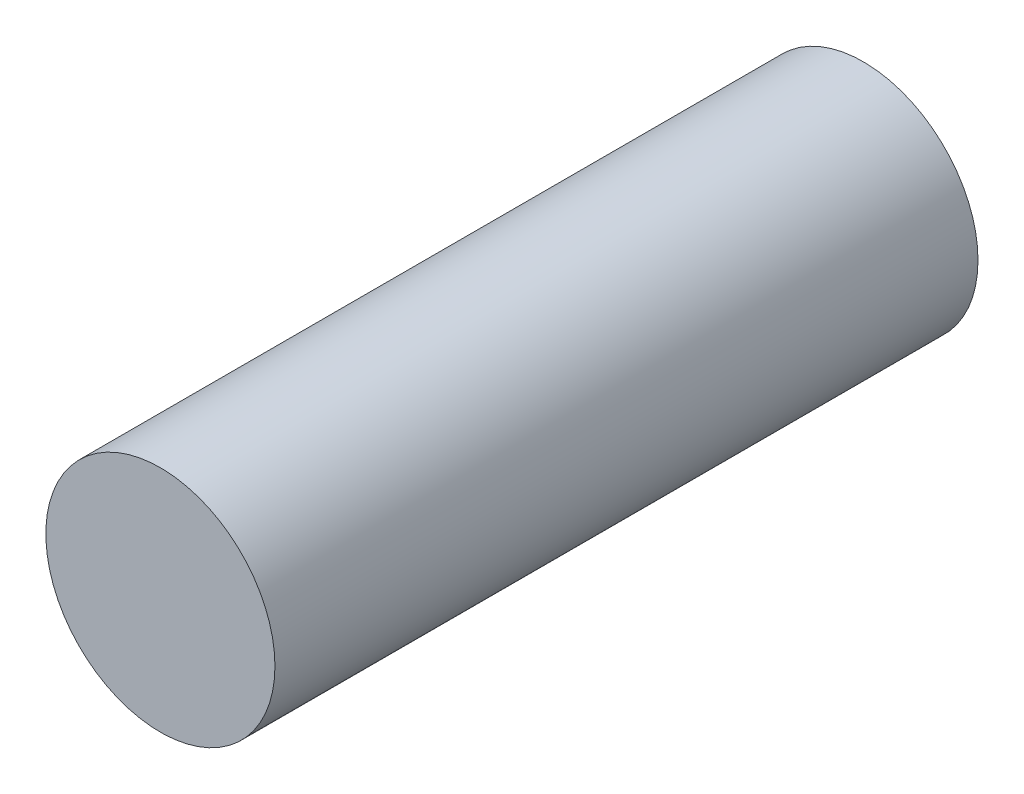
ISO-10303-21;
HEADER;
FILE_DESCRIPTION(('STEP AP214'),'2;1');
FILE_NAME('part.step','',(''),(''),'','','');
FILE_SCHEMA(('AUTOMOTIVE_DESIGN { 1 0 10303 214 1 1 1 1 }'));
ENDSEC;
DATA;
#1=APPLICATION_CONTEXT('core data for automotive mechanical design processes');
#2=APPLICATION_PROTOCOL_DEFINITION('international standard','automotive_design',2000,#1);
#3=PRODUCT_CONTEXT('',#1,'mechanical');
#4=PRODUCT('Part','Part','',(#3));
#5=PRODUCT_RELATED_PRODUCT_CATEGORY('part','',(#4));
#6=PRODUCT_DEFINITION_FORMATION('','',#4);
#7=PRODUCT_DEFINITION_CONTEXT('part definition',#1,'design');
#8=PRODUCT_DEFINITION('design','',#6,#7);
#9=PRODUCT_DEFINITION_SHAPE('','',#8);
#10=(LENGTH_UNIT() NAMED_UNIT(*) SI_UNIT(.MILLI.,.METRE.));
#11=(NAMED_UNIT(*) PLANE_ANGLE_UNIT() SI_UNIT($,.RADIAN.));
#12=(NAMED_UNIT(*) SI_UNIT($,.STERADIAN.) SOLID_ANGLE_UNIT());
#13=UNCERTAINTY_MEASURE_WITH_UNIT(LENGTH_MEASURE(1.E-05),#10,'distance_accuracy_value','');
#14=(GEOMETRIC_REPRESENTATION_CONTEXT(3) GLOBAL_UNCERTAINTY_ASSIGNED_CONTEXT((#13)) GLOBAL_UNIT_ASSIGNED_CONTEXT((#10,
#11,#12)) REPRESENTATION_CONTEXT('',''));
#15=CARTESIAN_POINT('',(0.,0.,0.));
#16=DIRECTION('',(0.,0.,1.));
#17=DIRECTION('',(1.,0.,0.));
#18=AXIS2_PLACEMENT_3D('',#15,#16,#17);
#19=CARTESIAN_POINT('',(0.,0.,-91.14));
#20=DIRECTION('',(0.,0.,1.));
#21=DIRECTION('',(1.,0.,0.));
#22=AXIS2_PLACEMENT_3D('',#19,#20,#21);
#23=CYLINDRICAL_SURFACE('',#22,14.85);
#24=CARTESIAN_POINT('',(0.,0.,-91.14));
#25=DIRECTION('',(0.,0.,1.));
#26=DIRECTION('',(1.,0.,0.));
#27=AXIS2_PLACEMENT_3D('',#24,#25,#26);
#28=CIRCLE('',#27,14.85);
#29=CARTESIAN_POINT('',(14.85,0.,-91.14));
#30=VERTEX_POINT('',#29);
#31=EDGE_CURVE('E10',#30,#30,#28,.T.);
#32=ORIENTED_EDGE('',*,*,#31,.T.);
#33=EDGE_LOOP('',(#32));
#34=FACE_BOUND('',#33,.T.);
#35=CARTESIAN_POINT('',(0.,0.,0.));
#36=DIRECTION('',(0.,0.,1.));
#37=DIRECTION('',(1.,0.,0.));
#38=AXIS2_PLACEMENT_3D('',#35,#36,#37);
#39=CIRCLE('',#38,14.85);
#40=CARTESIAN_POINT('',(14.85,0.,0.));
#41=VERTEX_POINT('',#40);
#42=EDGE_CURVE('E37',#41,#41,#39,.T.);
#43=ORIENTED_EDGE('',*,*,#42,.F.);
#44=EDGE_LOOP('',(#43));
#45=FACE_BOUND('',#44,.T.);
#46=ADVANCED_FACE('F40',(#34,#45),#23,.T.);
#47=CARTESIAN_POINT('',(0.,0.,-91.14));
#48=DIRECTION('',(0.,0.,1.));
#49=DIRECTION('',(1.,0.,0.));
#50=AXIS2_PLACEMENT_3D('',#47,#48,#49);
#51=PLANE('',#50);
#52=ORIENTED_EDGE('',*,*,#31,.F.);
#53=EDGE_LOOP('',(#52));
#54=FACE_BOUND('',#53,.T.);
#55=ADVANCED_FACE('F55',(#54),#51,.F.);
#56=CARTESIAN_POINT('',(0.,0.,0.));
#57=DIRECTION('',(0.,0.,1.));
#58=DIRECTION('',(1.,0.,0.));
#59=AXIS2_PLACEMENT_3D('',#56,#57,#58);
#60=PLANE('',#59);
#61=ORIENTED_EDGE('',*,*,#42,.T.);
#62=EDGE_LOOP('',(#61));
#63=FACE_BOUND('',#62,.T.);
#64=ADVANCED_FACE('F47',(#63),#60,.T.);
#65=CLOSED_SHELL('',(#46,#55,#64));
#66=MANIFOLD_SOLID_BREP('B2',#65);
#67=ADVANCED_BREP_SHAPE_REPRESENTATION('',(#18,#66),#14);
#68=SHAPE_DEFINITION_REPRESENTATION(#9,#67);
ENDSEC;
END-ISO-10303-21;
